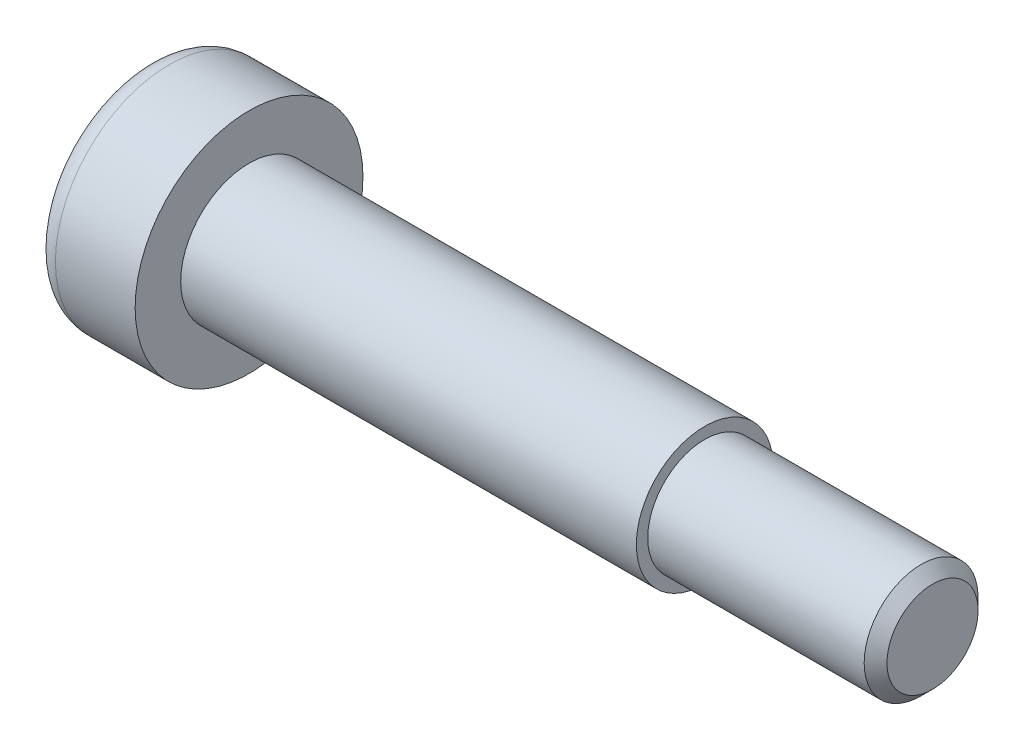
ISO-10303-21;
HEADER;
FILE_DESCRIPTION(('STEP AP214'),'2;1');
FILE_NAME('part.step','',(''),(''),'','','');
FILE_SCHEMA(('AUTOMOTIVE_DESIGN { 1 0 10303 214 1 1 1 1 }'));
ENDSEC;
DATA;
#1=APPLICATION_CONTEXT('core data for automotive mechanical design processes');
#2=APPLICATION_PROTOCOL_DEFINITION('international standard','automotive_design',2000,#1);
#3=PRODUCT_CONTEXT('',#1,'mechanical');
#4=PRODUCT('Part','Part','',(#3));
#5=PRODUCT_RELATED_PRODUCT_CATEGORY('part','',(#4));
#6=PRODUCT_DEFINITION_FORMATION('','',#4);
#7=PRODUCT_DEFINITION_CONTEXT('part definition',#1,'design');
#8=PRODUCT_DEFINITION('design','',#6,#7);
#9=PRODUCT_DEFINITION_SHAPE('','',#8);
#10=(LENGTH_UNIT() NAMED_UNIT(*) SI_UNIT(.MILLI.,.METRE.));
#11=(NAMED_UNIT(*) PLANE_ANGLE_UNIT() SI_UNIT($,.RADIAN.));
#12=(NAMED_UNIT(*) SI_UNIT($,.STERADIAN.) SOLID_ANGLE_UNIT());
#13=UNCERTAINTY_MEASURE_WITH_UNIT(LENGTH_MEASURE(1.E-05),#10,'distance_accuracy_value','');
#14=(GEOMETRIC_REPRESENTATION_CONTEXT(3) GLOBAL_UNCERTAINTY_ASSIGNED_CONTEXT((#13)) GLOBAL_UNIT_ASSIGNED_CONTEXT((#10,
#11,#12)) REPRESENTATION_CONTEXT('',''));
#15=CARTESIAN_POINT('',(0.,0.,0.));
#16=DIRECTION('',(0.,0.,1.));
#17=DIRECTION('',(1.,0.,0.));
#18=AXIS2_PLACEMENT_3D('',#15,#16,#17);
#19=CARTESIAN_POINT('',(0.,0.,0.));
#20=DIRECTION('',(1.,0.,0.));
#21=DIRECTION('',(0.,0.,-1.));
#22=AXIS2_PLACEMENT_3D('',#19,#20,#21);
#23=PLANE('',#22);
#24=CARTESIAN_POINT('',(0.,0.,0.));
#25=DIRECTION('',(1.,0.,0.));
#26=DIRECTION('',(0.,0.,-1.));
#27=AXIS2_PLACEMENT_3D('',#24,#25,#26);
#28=CIRCLE('',#27,4.);
#29=CARTESIAN_POINT('',(0.,0.,-4.));
#30=VERTEX_POINT('',#29);
#31=EDGE_CURVE('E155',#30,#30,#28,.F.);
#32=ORIENTED_EDGE('',*,*,#31,.T.);
#33=EDGE_LOOP('',(#32));
#34=FACE_BOUND('',#33,.T.);
#35=DIRECTION('',(0.,-0.5,-0.866025403784439));
#36=VECTOR('',#35,1.);
#37=CARTESIAN_POINT('',(0.,1.73205080756888,0.));
#38=LINE('',#37,#36);
#39=CARTESIAN_POINT('',(0.,1.73205080756888,0.));
#40=VERTEX_POINT('',#39);
#41=CARTESIAN_POINT('',(0.,0.866025403784439,-1.5));
#42=VERTEX_POINT('',#41);
#43=EDGE_CURVE('E125',#40,#42,#38,.T.);
#44=ORIENTED_EDGE('',*,*,#43,.F.);
#45=DIRECTION('',(0.,0.5,-0.866025403784439));
#46=VECTOR('',#45,1.);
#47=CARTESIAN_POINT('',(0.,0.86602540378444,1.5));
#48=LINE('',#47,#46);
#49=CARTESIAN_POINT('',(0.,0.86602540378444,1.5));
#50=VERTEX_POINT('',#49);
#51=EDGE_CURVE('E51',#50,#40,#48,.T.);
#52=ORIENTED_EDGE('',*,*,#51,.F.);
#53=DIRECTION('',(0.,1.,0.));
#54=VECTOR('',#53,1.);
#55=CARTESIAN_POINT('',(0.,-0.866025403784439,1.5));
#56=LINE('',#55,#54);
#57=CARTESIAN_POINT('',(0.,-0.866025403784439,1.5));
#58=VERTEX_POINT('',#57);
#59=EDGE_CURVE('E134',#58,#50,#56,.T.);
#60=ORIENTED_EDGE('',*,*,#59,.F.);
#61=DIRECTION('',(0.,0.5,0.866025403784439));
#62=VECTOR('',#61,1.);
#63=CARTESIAN_POINT('',(0.,-1.73205080756888,0.));
#64=LINE('',#63,#62);
#65=CARTESIAN_POINT('',(0.,-1.73205080756888,0.));
#66=VERTEX_POINT('',#65);
#67=EDGE_CURVE('E132',#66,#58,#64,.T.);
#68=ORIENTED_EDGE('',*,*,#67,.F.);
#69=DIRECTION('',(0.,-0.5,0.866025403784439));
#70=VECTOR('',#69,1.);
#71=CARTESIAN_POINT('',(0.,-0.866025403784439,-1.5));
#72=LINE('',#71,#70);
#73=CARTESIAN_POINT('',(0.,-0.866025403784439,-1.5));
#74=VERTEX_POINT('',#73);
#75=EDGE_CURVE('E99',#74,#66,#72,.T.);
#76=ORIENTED_EDGE('',*,*,#75,.F.);
#77=DIRECTION('',(0.,-1.,0.));
#78=VECTOR('',#77,1.);
#79=CARTESIAN_POINT('',(0.,0.866025403784439,-1.5));
#80=LINE('',#79,#78);
#81=EDGE_CURVE('E128',#42,#74,#80,.T.);
#82=ORIENTED_EDGE('',*,*,#81,.F.);
#83=EDGE_LOOP('',(#44,#52,#60,#68,#76,#82));
#84=FACE_BOUND('',#83,.T.);
#85=ADVANCED_FACE('F36',(#34,#84),#23,.F.);
#86=CARTESIAN_POINT('',(0.,0.,0.));
#87=DIRECTION('',(-1.,0.,0.));
#88=DIRECTION('',(0.,0.,1.));
#89=AXIS2_PLACEMENT_3D('',#86,#87,#88);
#90=CYLINDRICAL_SURFACE('',#89,5.);
#91=CARTESIAN_POINT('',(1.,0.,0.));
#92=DIRECTION('',(1.,0.,0.));
#93=DIRECTION('',(0.,0.,-1.));
#94=AXIS2_PLACEMENT_3D('',#91,#92,#93);
#95=CIRCLE('',#94,5.);
#96=CARTESIAN_POINT('',(1.,0.,-5.));
#97=VERTEX_POINT('',#96);
#98=EDGE_CURVE('E158',#97,#97,#95,.T.);
#99=ORIENTED_EDGE('',*,*,#98,.T.);
#100=EDGE_LOOP('',(#99));
#101=FACE_BOUND('',#100,.T.);
#102=CARTESIAN_POINT('',(4.5,0.,0.));
#103=DIRECTION('',(-1.,0.,0.));
#104=DIRECTION('',(0.,0.,1.));
#105=AXIS2_PLACEMENT_3D('',#102,#103,#104);
#106=CIRCLE('',#105,5.);
#107=CARTESIAN_POINT('',(4.5,0.,5.));
#108=VERTEX_POINT('',#107);
#109=EDGE_CURVE('E152',#108,#108,#106,.T.);
#110=ORIENTED_EDGE('',*,*,#109,.T.);
#111=EDGE_LOOP('',(#110));
#112=FACE_BOUND('',#111,.T.);
#113=ADVANCED_FACE('F175',(#101,#112),#90,.T.);
#114=CARTESIAN_POINT('',(4.5,5.,0.));
#115=DIRECTION('',(-1.,0.,0.));
#116=DIRECTION('',(0.,0.,1.));
#117=AXIS2_PLACEMENT_3D('',#114,#115,#116);
#118=PLANE('',#117);
#119=ORIENTED_EDGE('',*,*,#109,.F.);
#120=EDGE_LOOP('',(#119));
#121=FACE_BOUND('',#120,.T.);
#122=CARTESIAN_POINT('',(4.5,0.,0.));
#123=DIRECTION('',(-1.,0.,0.));
#124=DIRECTION('',(0.,0.,1.));
#125=AXIS2_PLACEMENT_3D('',#122,#123,#124);
#126=CIRCLE('',#125,3.);
#127=CARTESIAN_POINT('',(4.5,0.,3.));
#128=VERTEX_POINT('',#127);
#129=EDGE_CURVE('E149',#128,#128,#126,.T.);
#130=ORIENTED_EDGE('',*,*,#129,.T.);
#131=EDGE_LOOP('',(#130));
#132=FACE_BOUND('',#131,.T.);
#133=ADVANCED_FACE('F181',(#121,#132),#118,.F.);
#134=CARTESIAN_POINT('',(0.,0.,0.));
#135=DIRECTION('',(-1.,0.,0.));
#136=DIRECTION('',(0.,0.,1.));
#137=AXIS2_PLACEMENT_3D('',#134,#135,#136);
#138=CYLINDRICAL_SURFACE('',#137,3.);
#139=ORIENTED_EDGE('',*,*,#129,.F.);
#140=EDGE_LOOP('',(#139));
#141=FACE_BOUND('',#140,.T.);
#142=CARTESIAN_POINT('',(24.5,0.,0.));
#143=DIRECTION('',(-1.,0.,0.));
#144=DIRECTION('',(0.,0.,1.));
#145=AXIS2_PLACEMENT_3D('',#142,#143,#144);
#146=CIRCLE('',#145,3.);
#147=CARTESIAN_POINT('',(24.5,0.,3.));
#148=VERTEX_POINT('',#147);
#149=EDGE_CURVE('E146',#148,#148,#146,.T.);
#150=ORIENTED_EDGE('',*,*,#149,.T.);
#151=EDGE_LOOP('',(#150));
#152=FACE_BOUND('',#151,.T.);
#153=ADVANCED_FACE('F188',(#141,#152),#138,.T.);
#154=CARTESIAN_POINT('',(24.5,3.,0.));
#155=DIRECTION('',(-1.,0.,0.));
#156=DIRECTION('',(0.,0.,1.));
#157=AXIS2_PLACEMENT_3D('',#154,#155,#156);
#158=PLANE('',#157);
#159=ORIENTED_EDGE('',*,*,#149,.F.);
#160=EDGE_LOOP('',(#159));
#161=FACE_BOUND('',#160,.T.);
#162=CARTESIAN_POINT('',(24.5,0.,0.));
#163=DIRECTION('',(-1.,0.,0.));
#164=DIRECTION('',(0.,0.,1.));
#165=AXIS2_PLACEMENT_3D('',#162,#163,#164);
#166=CIRCLE('',#165,2.5);
#167=CARTESIAN_POINT('',(24.5,0.,2.5));
#168=VERTEX_POINT('',#167);
#169=EDGE_CURVE('E138',#168,#168,#166,.T.);
#170=ORIENTED_EDGE('',*,*,#169,.T.);
#171=EDGE_LOOP('',(#170));
#172=FACE_BOUND('',#171,.T.);
#173=ADVANCED_FACE('F192',(#161,#172),#158,.F.);
#174=CARTESIAN_POINT('',(0.,0.,0.));
#175=DIRECTION('',(-1.,0.,0.));
#176=DIRECTION('',(0.,0.,1.));
#177=AXIS2_PLACEMENT_3D('',#174,#175,#176);
#178=CYLINDRICAL_SURFACE('',#177,2.5);
#179=CARTESIAN_POINT('',(34.,0.,0.));
#180=DIRECTION('',(-1.,0.,0.));
#181=DIRECTION('',(0.,0.,1.));
#182=AXIS2_PLACEMENT_3D('',#179,#180,#181);
#183=CIRCLE('',#182,2.5);
#184=CARTESIAN_POINT('',(34.,0.,2.5));
#185=VERTEX_POINT('',#184);
#186=EDGE_CURVE('E44',#185,#185,#183,.T.);
#187=ORIENTED_EDGE('',*,*,#186,.T.);
#188=EDGE_LOOP('',(#187));
#189=FACE_BOUND('',#188,.T.);
#190=ORIENTED_EDGE('',*,*,#169,.F.);
#191=EDGE_LOOP('',(#190));
#192=FACE_BOUND('',#191,.T.);
#193=ADVANCED_FACE('F163',(#189,#192),#178,.T.);
#194=CARTESIAN_POINT('',(34.5,2.5,0.));
#195=DIRECTION('',(-1.,0.,0.));
#196=DIRECTION('',(0.,0.,1.));
#197=AXIS2_PLACEMENT_3D('',#194,#195,#196);
#198=PLANE('',#197);
#199=CARTESIAN_POINT('',(34.5,0.,0.));
#200=DIRECTION('',(-1.,0.,0.));
#201=DIRECTION('',(0.,0.,1.));
#202=AXIS2_PLACEMENT_3D('',#199,#200,#201);
#203=CIRCLE('',#202,1.99999999999999);
#204=CARTESIAN_POINT('',(34.5,0.,1.99999999999999));
#205=VERTEX_POINT('',#204);
#206=EDGE_CURVE('E11',#205,#205,#203,.F.);
#207=ORIENTED_EDGE('',*,*,#206,.T.);
#208=EDGE_LOOP('',(#207));
#209=FACE_BOUND('',#208,.T.);
#210=ADVANCED_FACE('F199',(#209),#198,.F.);
#211=CARTESIAN_POINT('',(3.,0.86602540378444,1.5));
#212=DIRECTION('',(0.,0.866025403784439,0.5));
#213=DIRECTION('',(0.,-0.5,0.866025403784439));
#214=AXIS2_PLACEMENT_3D('',#211,#212,#213);
#215=PLANE('',#214);
#216=ORIENTED_EDGE('',*,*,#51,.T.);
#217=DIRECTION('',(-1.,0.,0.));
#218=VECTOR('',#217,1.);
#219=CARTESIAN_POINT('',(3.,1.73205080756888,0.));
#220=LINE('',#219,#218);
#221=CARTESIAN_POINT('',(3.,1.73205080756888,0.));
#222=VERTEX_POINT('',#221);
#223=EDGE_CURVE('E81',#222,#40,#220,.T.);
#224=ORIENTED_EDGE('',*,*,#223,.F.);
#225=DIRECTION('',(0.,0.5,-0.866025403784439));
#226=VECTOR('',#225,1.);
#227=CARTESIAN_POINT('',(3.,0.86602540378444,1.5));
#228=LINE('',#227,#226);
#229=CARTESIAN_POINT('',(3.,0.86602540378444,1.5));
#230=VERTEX_POINT('',#229);
#231=EDGE_CURVE('E136',#230,#222,#228,.T.);
#232=ORIENTED_EDGE('',*,*,#231,.F.);
#233=DIRECTION('',(-1.,0.,0.));
#234=VECTOR('',#233,1.);
#235=CARTESIAN_POINT('',(3.,0.86602540378444,1.5));
#236=LINE('',#235,#234);
#237=EDGE_CURVE('E59',#230,#50,#236,.T.);
#238=ORIENTED_EDGE('',*,*,#237,.T.);
#239=EDGE_LOOP('',(#216,#224,#232,#238));
#240=FACE_BOUND('',#239,.T.);
#241=ADVANCED_FACE('F202',(#240),#215,.F.);
#242=CARTESIAN_POINT('',(3.,-0.866025403784439,1.5));
#243=DIRECTION('',(0.,0.,1.));
#244=DIRECTION('',(1.,0.,0.));
#245=AXIS2_PLACEMENT_3D('',#242,#243,#244);
#246=PLANE('',#245);
#247=ORIENTED_EDGE('',*,*,#59,.T.);
#248=ORIENTED_EDGE('',*,*,#237,.F.);
#249=DIRECTION('',(0.,1.,0.));
#250=VECTOR('',#249,1.);
#251=CARTESIAN_POINT('',(3.,-0.866025403784439,1.5));
#252=LINE('',#251,#250);
#253=CARTESIAN_POINT('',(3.,-0.866025403784439,1.5));
#254=VERTEX_POINT('',#253);
#255=EDGE_CURVE('E111',#254,#230,#252,.T.);
#256=ORIENTED_EDGE('',*,*,#255,.F.);
#257=DIRECTION('',(-1.,0.,0.));
#258=VECTOR('',#257,1.);
#259=CARTESIAN_POINT('',(3.,-0.866025403784439,1.5));
#260=LINE('',#259,#258);
#261=EDGE_CURVE('E103',#254,#58,#260,.T.);
#262=ORIENTED_EDGE('',*,*,#261,.T.);
#263=EDGE_LOOP('',(#247,#248,#256,#262));
#264=FACE_BOUND('',#263,.T.);
#265=ADVANCED_FACE('F206',(#264),#246,.F.);
#266=CARTESIAN_POINT('',(3.,-1.73205080756888,0.));
#267=DIRECTION('',(0.,-0.866025403784439,0.5));
#268=DIRECTION('',(0.,-0.5,-0.866025403784439));
#269=AXIS2_PLACEMENT_3D('',#266,#267,#268);
#270=PLANE('',#269);
#271=ORIENTED_EDGE('',*,*,#67,.T.);
#272=ORIENTED_EDGE('',*,*,#261,.F.);
#273=DIRECTION('',(0.,0.5,0.866025403784439));
#274=VECTOR('',#273,1.);
#275=CARTESIAN_POINT('',(3.,-1.73205080756888,0.));
#276=LINE('',#275,#274);
#277=CARTESIAN_POINT('',(3.,-1.73205080756888,0.));
#278=VERTEX_POINT('',#277);
#279=EDGE_CURVE('E107',#278,#254,#276,.T.);
#280=ORIENTED_EDGE('',*,*,#279,.F.);
#281=DIRECTION('',(-1.,0.,0.));
#282=VECTOR('',#281,1.);
#283=CARTESIAN_POINT('',(3.,-1.73205080756888,0.));
#284=LINE('',#283,#282);
#285=EDGE_CURVE('E92',#278,#66,#284,.T.);
#286=ORIENTED_EDGE('',*,*,#285,.T.);
#287=EDGE_LOOP('',(#271,#272,#280,#286));
#288=FACE_BOUND('',#287,.T.);
#289=ADVANCED_FACE('F108',(#288),#270,.F.);
#290=CARTESIAN_POINT('',(3.,-0.866025403784439,-1.5));
#291=DIRECTION('',(0.,-0.866025403784438,-0.5));
#292=DIRECTION('',(0.,0.5,-0.866025403784439));
#293=AXIS2_PLACEMENT_3D('',#290,#291,#292);
#294=PLANE('',#293);
#295=ORIENTED_EDGE('',*,*,#75,.T.);
#296=ORIENTED_EDGE('',*,*,#285,.F.);
#297=DIRECTION('',(0.,-0.5,0.866025403784439));
#298=VECTOR('',#297,1.);
#299=CARTESIAN_POINT('',(3.,-0.866025403784439,-1.5));
#300=LINE('',#299,#298);
#301=CARTESIAN_POINT('',(3.,-0.866025403784439,-1.5));
#302=VERTEX_POINT('',#301);
#303=EDGE_CURVE('E96',#302,#278,#300,.T.);
#304=ORIENTED_EDGE('',*,*,#303,.F.);
#305=DIRECTION('',(-1.,0.,0.));
#306=VECTOR('',#305,1.);
#307=CARTESIAN_POINT('',(3.,-0.866025403784439,-1.5));
#308=LINE('',#307,#306);
#309=EDGE_CURVE('E104',#302,#74,#308,.T.);
#310=ORIENTED_EDGE('',*,*,#309,.T.);
#311=EDGE_LOOP('',(#295,#296,#304,#310));
#312=FACE_BOUND('',#311,.T.);
#313=ADVANCED_FACE('F94',(#312),#294,.F.);
#314=CARTESIAN_POINT('',(3.,0.866025403784439,-1.5));
#315=DIRECTION('',(0.,0.,-1.));
#316=DIRECTION('',(-1.,0.,0.));
#317=AXIS2_PLACEMENT_3D('',#314,#315,#316);
#318=PLANE('',#317);
#319=ORIENTED_EDGE('',*,*,#81,.T.);
#320=ORIENTED_EDGE('',*,*,#309,.F.);
#321=DIRECTION('',(0.,-1.,0.));
#322=VECTOR('',#321,1.);
#323=CARTESIAN_POINT('',(3.,0.866025403784439,-1.5));
#324=LINE('',#323,#322);
#325=CARTESIAN_POINT('',(3.,0.866025403784439,-1.5));
#326=VERTEX_POINT('',#325);
#327=EDGE_CURVE('E117',#326,#302,#324,.T.);
#328=ORIENTED_EDGE('',*,*,#327,.F.);
#329=DIRECTION('',(-1.,0.,0.));
#330=VECTOR('',#329,1.);
#331=CARTESIAN_POINT('',(3.,0.866025403784439,-1.5));
#332=LINE('',#331,#330);
#333=EDGE_CURVE('E141',#326,#42,#332,.T.);
#334=ORIENTED_EDGE('',*,*,#333,.T.);
#335=EDGE_LOOP('',(#319,#320,#328,#334));
#336=FACE_BOUND('',#335,.T.);
#337=ADVANCED_FACE('F210',(#336),#318,.F.);
#338=CARTESIAN_POINT('',(3.,1.73205080756888,0.));
#339=DIRECTION('',(0.,0.866025403784439,-0.5));
#340=DIRECTION('',(0.,0.5,0.866025403784439));
#341=AXIS2_PLACEMENT_3D('',#338,#339,#340);
#342=PLANE('',#341);
#343=ORIENTED_EDGE('',*,*,#43,.T.);
#344=ORIENTED_EDGE('',*,*,#333,.F.);
#345=DIRECTION('',(0.,-0.5,-0.866025403784439));
#346=VECTOR('',#345,1.);
#347=CARTESIAN_POINT('',(3.,1.73205080756888,0.));
#348=LINE('',#347,#346);
#349=EDGE_CURVE('E119',#222,#326,#348,.T.);
#350=ORIENTED_EDGE('',*,*,#349,.F.);
#351=ORIENTED_EDGE('',*,*,#223,.T.);
#352=EDGE_LOOP('',(#343,#344,#350,#351));
#353=FACE_BOUND('',#352,.T.);
#354=ADVANCED_FACE('F207',(#353),#342,.F.);
#355=CARTESIAN_POINT('',(3.,0.,0.));
#356=DIRECTION('',(-1.,0.,0.));
#357=DIRECTION('',(0.,0.,1.));
#358=AXIS2_PLACEMENT_3D('',#355,#356,#357);
#359=PLANE('',#358);
#360=ORIENTED_EDGE('',*,*,#231,.T.);
#361=ORIENTED_EDGE('',*,*,#349,.T.);
#362=ORIENTED_EDGE('',*,*,#327,.T.);
#363=ORIENTED_EDGE('',*,*,#303,.T.);
#364=ORIENTED_EDGE('',*,*,#279,.T.);
#365=ORIENTED_EDGE('',*,*,#255,.T.);
#366=EDGE_LOOP('',(#360,#361,#362,#363,#364,#365));
#367=FACE_BOUND('',#366,.T.);
#368=ADVANCED_FACE('F114',(#367),#359,.T.);
#369=CARTESIAN_POINT('',(1.,0.,0.));
#370=DIRECTION('',(1.,0.,0.));
#371=DIRECTION('',(0.,0.,-1.));
#372=AXIS2_PLACEMENT_3D('',#369,#370,#371);
#373=TOROIDAL_SURFACE('',#372,4.,1.);
#374=ORIENTED_EDGE('',*,*,#98,.F.);
#375=EDGE_LOOP('',(#374));
#376=FACE_BOUND('',#375,.T.);
#377=ORIENTED_EDGE('',*,*,#31,.F.);
#378=EDGE_LOOP('',(#377));
#379=FACE_BOUND('',#378,.T.);
#380=ADVANCED_FACE('F167',(#376,#379),#373,.T.);
#381=CARTESIAN_POINT('',(34.,0.,0.));
#382=DIRECTION('',(-1.,0.,0.));
#383=DIRECTION('',(0.,0.,1.));
#384=AXIS2_PLACEMENT_3D('',#381,#382,#383);
#385=CONICAL_SURFACE('',#384,2.5,0.785398163397449);
#386=ORIENTED_EDGE('',*,*,#206,.F.);
#387=EDGE_LOOP('',(#386));
#388=FACE_BOUND('',#387,.T.);
#389=ORIENTED_EDGE('',*,*,#186,.F.);
#390=EDGE_LOOP('',(#389));
#391=FACE_BOUND('',#390,.T.);
#392=ADVANCED_FACE('F38',(#388,#391),#385,.T.);
#393=CLOSED_SHELL('',(#85,#113,#133,#153,#173,#193,#210,#241,#265,#289,#313,#337,#354,#368,#380,#392));
#394=MANIFOLD_SOLID_BREP('B2',#393);
#395=ADVANCED_BREP_SHAPE_REPRESENTATION('',(#18,#394),#14);
#396=SHAPE_DEFINITION_REPRESENTATION(#9,#395);
ENDSEC;
END-ISO-10303-21;
